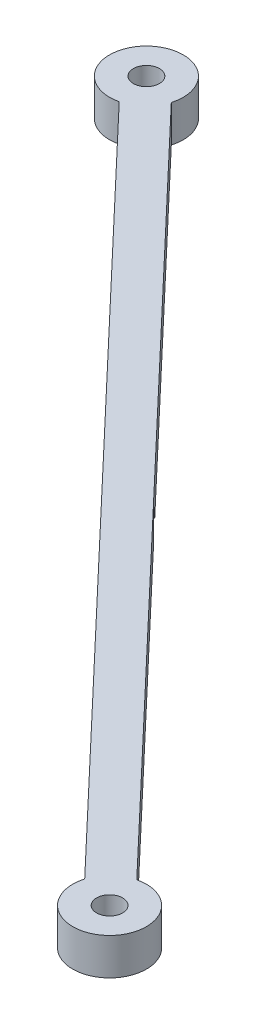
ISO-10303-21;
HEADER;
FILE_DESCRIPTION(('STEP AP214'),'2;1');
FILE_NAME('part.step','',(''),(''),'','','');
FILE_SCHEMA(('AUTOMOTIVE_DESIGN { 1 0 10303 214 1 1 1 1 }'));
ENDSEC;
DATA;
#1=APPLICATION_CONTEXT('core data for automotive mechanical design processes');
#2=APPLICATION_PROTOCOL_DEFINITION('international standard','automotive_design',2000,#1);
#3=PRODUCT_CONTEXT('',#1,'mechanical');
#4=PRODUCT('Part','Part','',(#3));
#5=PRODUCT_RELATED_PRODUCT_CATEGORY('part','',(#4));
#6=PRODUCT_DEFINITION_FORMATION('','',#4);
#7=PRODUCT_DEFINITION_CONTEXT('part definition',#1,'design');
#8=PRODUCT_DEFINITION('design','',#6,#7);
#9=PRODUCT_DEFINITION_SHAPE('','',#8);
#10=(LENGTH_UNIT() NAMED_UNIT(*) SI_UNIT(.MILLI.,.METRE.));
#11=(NAMED_UNIT(*) PLANE_ANGLE_UNIT() SI_UNIT($,.RADIAN.));
#12=(NAMED_UNIT(*) SI_UNIT($,.STERADIAN.) SOLID_ANGLE_UNIT());
#13=UNCERTAINTY_MEASURE_WITH_UNIT(LENGTH_MEASURE(1.E-05),#10,'distance_accuracy_value','');
#14=(GEOMETRIC_REPRESENTATION_CONTEXT(3) GLOBAL_UNCERTAINTY_ASSIGNED_CONTEXT((#13)) GLOBAL_UNIT_ASSIGNED_CONTEXT((#10,
#11,#12)) REPRESENTATION_CONTEXT('',''));
#15=CARTESIAN_POINT('',(0.,0.,0.));
#16=DIRECTION('',(0.,0.,1.));
#17=DIRECTION('',(1.,0.,0.));
#18=AXIS2_PLACEMENT_3D('',#15,#16,#17);
#19=CARTESIAN_POINT('',(0.,0.,0.));
#20=DIRECTION('',(0.,1.,0.));
#21=DIRECTION('',(0.,0.,1.));
#22=AXIS2_PLACEMENT_3D('',#19,#20,#21);
#23=PLANE('',#22);
#24=CARTESIAN_POINT('',(-28.3882084843557,0.,6.42766488000816));
#25=DIRECTION('',(0.,1.,0.));
#26=DIRECTION('',(0.,0.,1.));
#27=AXIS2_PLACEMENT_3D('',#24,#25,#26);
#28=CIRCLE('',#27,2.2479);
#29=CARTESIAN_POINT('',(-28.3882084843557,0.,8.67556488000816));
#30=VERTEX_POINT('',#29);
#31=EDGE_CURVE('E143',#30,#30,#28,.T.);
#32=ORIENTED_EDGE('',*,*,#31,.T.);
#33=EDGE_LOOP('',(#32));
#34=FACE_BOUND('',#33,.T.);
#35=DIRECTION('',(-0.688749461914693,0.,-0.724999433594414));
#36=VECTOR('',#35,1.);
#37=CARTESIAN_POINT('',(-15.8292648379506,0.,15.0378015960531));
#38=LINE('',#37,#36);
#39=CARTESIAN_POINT('',(31.9273773785152,0.,65.307951297596));
#40=VERTEX_POINT('',#39);
#41=CARTESIAN_POINT('',(-22.2987220117262,0.,8.22784667628931));
#42=VERTEX_POINT('',#41);
#43=EDGE_CURVE('E163',#40,#42,#38,.T.);
#44=ORIENTED_EDGE('',*,*,#43,.F.);
#45=DIRECTION('',(0.686088283890144,0.,-0.727518293040579));
#46=VECTOR('',#45,1.);
#47=CARTESIAN_POINT('',(31.9273773785152,0.,65.307951297596));
#48=LINE('',#47,#46);
#49=CARTESIAN_POINT('',(27.5641346062818,0.,69.9346720976923));
#50=VERTEX_POINT('',#49);
#51=EDGE_CURVE('E122',#50,#40,#48,.T.);
#52=ORIENTED_EDGE('',*,*,#51,.F.);
#53=DIRECTION('',(-0.688749461914693,0.,-0.724999433594414));
#54=VECTOR('',#53,1.);
#55=CARTESIAN_POINT('',(-20.4330112412751,0.,19.4113606792114));
#56=LINE('',#55,#54);
#57=CARTESIAN_POINT('',(-26.9024684150507,0.,12.6014057594476));
#58=VERTEX_POINT('',#57);
#59=EDGE_CURVE('E78',#50,#58,#56,.T.);
#60=ORIENTED_EDGE('',*,*,#59,.T.);
#61=CARTESIAN_POINT('',(-28.3882084843557,0.,6.42766488000816));
#62=DIRECTION('',(0.,1.,0.));
#63=DIRECTION('',(0.,0.,1.));
#64=AXIS2_PLACEMENT_3D('',#61,#62,#63);
#65=CIRCLE('',#64,6.35);
#66=EDGE_CURVE('E165',#42,#58,#65,.T.);
#67=ORIENTED_EDGE('',*,*,#66,.F.);
#68=EDGE_LOOP('',(#44,#52,#60,#67));
#69=FACE_BOUND('',#68,.T.);
#70=ADVANCED_FACE('F33',(#34,#69),#23,.F.);
#71=CARTESIAN_POINT('',(-20.4330112412751,6.35,19.4113606792114));
#72=DIRECTION('',(-0.724999433594414,0.,0.688749461914693));
#73=DIRECTION('',(0.688749461914693,0.,0.724999433594414));
#74=AXIS2_PLACEMENT_3D('',#71,#72,#73);
#75=PLANE('',#74);
#76=DIRECTION('',(0.,-1.,0.));
#77=VECTOR('',#76,1.);
#78=CARTESIAN_POINT('',(27.5641346062818,3.175,69.9346720976923));
#79=LINE('',#78,#77);
#80=CARTESIAN_POINT('',(27.5641346062818,3.175,69.9346720976923));
#81=VERTEX_POINT('',#80);
#82=EDGE_CURVE('E128',#81,#50,#79,.T.);
#83=ORIENTED_EDGE('',*,*,#82,.F.);
#84=DIRECTION('',(0.688749461914693,0.,0.724999433594414));
#85=VECTOR('',#84,1.);
#86=CARTESIAN_POINT('',(-20.4330112412751,3.175,19.4113606792114));
#87=LINE('',#86,#85);
#88=CARTESIAN_POINT('',(31.9434483698445,3.175,74.5444760593373));
#89=VERTEX_POINT('',#88);
#90=EDGE_CURVE('E136',#81,#89,#87,.T.);
#91=ORIENTED_EDGE('',*,*,#90,.T.);
#92=DIRECTION('',(0.,1.,0.));
#93=VECTOR('',#92,1.);
#94=CARTESIAN_POINT('',(31.9434483698445,6.35,74.5444760593373));
#95=LINE('',#94,#93);
#96=CARTESIAN_POINT('',(31.9434483698445,0.,74.5444760593373));
#97=VERTEX_POINT('',#96);
#98=EDGE_CURVE('E110',#97,#89,#95,.T.);
#99=ORIENTED_EDGE('',*,*,#98,.F.);
#100=CARTESIAN_POINT('',(86.1723050430148,0.,131.627483083727));
#101=VERTEX_POINT('',#100);
#102=EDGE_CURVE('E157',#101,#97,#56,.T.);
#103=ORIENTED_EDGE('',*,*,#102,.F.);
#104=DIRECTION('',(0.,-1.,0.));
#105=VECTOR('',#104,1.);
#106=CARTESIAN_POINT('',(86.1723050430148,6.35,131.627483083727));
#107=LINE('',#106,#105);
#108=CARTESIAN_POINT('',(86.1723050430148,6.35,131.627483083727));
#109=VERTEX_POINT('',#108);
#110=EDGE_CURVE('E11',#109,#101,#107,.T.);
#111=ORIENTED_EDGE('',*,*,#110,.F.);
#112=DIRECTION('',(-0.688749461914693,0.,-0.724999433594414));
#113=VECTOR('',#112,1.);
#114=CARTESIAN_POINT('',(-20.4330112412751,6.35,19.4113606792114));
#115=LINE('',#114,#113);
#116=CARTESIAN_POINT('',(-26.9024684150507,6.35,12.6014057594476));
#117=VERTEX_POINT('',#116);
#118=EDGE_CURVE('E142',#109,#117,#115,.T.);
#119=ORIENTED_EDGE('',*,*,#118,.T.);
#120=DIRECTION('',(0.,-1.,0.));
#121=VECTOR('',#120,1.);
#122=CARTESIAN_POINT('',(-26.9024684150507,6.35,12.6014057594476));
#123=LINE('',#122,#121);
#124=EDGE_CURVE('E154',#117,#58,#123,.T.);
#125=ORIENTED_EDGE('',*,*,#124,.T.);
#126=ORIENTED_EDGE('',*,*,#59,.F.);
#127=EDGE_LOOP('',(#83,#91,#99,#103,#111,#119,#125,#126));
#128=FACE_BOUND('',#127,.T.);
#129=ADVANCED_FACE('F181',(#128),#75,.T.);
#130=CARTESIAN_POINT('',(92.2617915156443,6.35,133.427664880008));
#131=DIRECTION('',(0.,-1.,0.));
#132=DIRECTION('',(0.,0.,-1.));
#133=AXIS2_PLACEMENT_3D('',#130,#131,#132);
#134=CYLINDRICAL_SURFACE('',#133,6.34999999999999);
#135=CARTESIAN_POINT('',(92.2617915156443,0.,133.427664880008));
#136=DIRECTION('',(0.,1.,0.));
#137=DIRECTION('',(0.,0.,1.));
#138=AXIS2_PLACEMENT_3D('',#135,#136,#137);
#139=CIRCLE('',#138,6.34999999999999);
#140=CARTESIAN_POINT('',(90.7760514463393,0.,127.253924000569));
#141=VERTEX_POINT('',#140);
#142=EDGE_CURVE('E160',#101,#141,#139,.T.);
#143=ORIENTED_EDGE('',*,*,#142,.T.);
#144=DIRECTION('',(0.,-1.,0.));
#145=VECTOR('',#144,1.);
#146=CARTESIAN_POINT('',(90.7760514463393,6.35,127.253924000569));
#147=LINE('',#146,#145);
#148=CARTESIAN_POINT('',(90.7760514463393,6.35,127.253924000569));
#149=VERTEX_POINT('',#148);
#150=EDGE_CURVE('E41',#149,#141,#147,.T.);
#151=ORIENTED_EDGE('',*,*,#150,.F.);
#152=CARTESIAN_POINT('',(92.2617915156443,6.35,133.427664880008));
#153=DIRECTION('',(0.,1.,0.));
#154=DIRECTION('',(0.,0.,1.));
#155=AXIS2_PLACEMENT_3D('',#152,#153,#154);
#156=CIRCLE('',#155,6.34999999999999);
#157=EDGE_CURVE('E145',#109,#149,#156,.T.);
#158=ORIENTED_EDGE('',*,*,#157,.F.);
#159=ORIENTED_EDGE('',*,*,#110,.T.);
#160=EDGE_LOOP('',(#143,#151,#158,#159));
#161=FACE_BOUND('',#160,.T.);
#162=ADVANCED_FACE('F177',(#161),#134,.T.);
#163=CARTESIAN_POINT('',(-15.8292648379506,6.35,15.0378015960531));
#164=DIRECTION('',(-0.724999433594414,0.,0.688749461914693));
#165=DIRECTION('',(0.688749461914693,0.,0.724999433594414));
#166=AXIS2_PLACEMENT_3D('',#163,#164,#165);
#167=PLANE('',#166);
#168=DIRECTION('',(0.688749461914693,0.,0.724999433594414));
#169=VECTOR('',#168,1.);
#170=CARTESIAN_POINT('',(36.3227621867349,3.175,69.9346721483537));
#171=LINE('',#170,#169);
#172=CARTESIAN_POINT('',(31.9273773785152,3.175,65.307951297596));
#173=VERTEX_POINT('',#172);
#174=CARTESIAN_POINT('',(36.3227621867349,3.175,69.9346721483537));
#175=VERTEX_POINT('',#174);
#176=EDGE_CURVE('E114',#173,#175,#171,.T.);
#177=ORIENTED_EDGE('',*,*,#176,.F.);
#178=DIRECTION('',(0.,-1.,0.));
#179=VECTOR('',#178,1.);
#180=CARTESIAN_POINT('',(31.9273773785152,3.175,65.307951297596));
#181=LINE('',#180,#179);
#182=EDGE_CURVE('E130',#173,#40,#181,.T.);
#183=ORIENTED_EDGE('',*,*,#182,.T.);
#184=ORIENTED_EDGE('',*,*,#43,.T.);
#185=DIRECTION('',(0.,-1.,0.));
#186=VECTOR('',#185,1.);
#187=CARTESIAN_POINT('',(-22.2987220117262,6.35,8.22784667628931));
#188=LINE('',#187,#186);
#189=CARTESIAN_POINT('',(-22.2987220117262,6.35,8.22784667628931));
#190=VERTEX_POINT('',#189);
#191=EDGE_CURVE('E171',#190,#42,#188,.T.);
#192=ORIENTED_EDGE('',*,*,#191,.F.);
#193=DIRECTION('',(-0.688749461914693,0.,-0.724999433594414));
#194=VECTOR('',#193,1.);
#195=CARTESIAN_POINT('',(-15.8292648379506,6.35,15.0378015960531));
#196=LINE('',#195,#194);
#197=EDGE_CURVE('E148',#149,#190,#196,.T.);
#198=ORIENTED_EDGE('',*,*,#197,.F.);
#199=ORIENTED_EDGE('',*,*,#150,.T.);
#200=CARTESIAN_POINT('',(36.3227621867349,0.,69.9346721483537));
#201=VERTEX_POINT('',#200);
#202=EDGE_CURVE('E127',#141,#201,#38,.T.);
#203=ORIENTED_EDGE('',*,*,#202,.T.);
#204=DIRECTION('',(0.,-1.,0.));
#205=VECTOR('',#204,1.);
#206=CARTESIAN_POINT('',(36.3227621867349,3.175,69.9346721483537));
#207=LINE('',#206,#205);
#208=EDGE_CURVE('E48',#175,#201,#207,.T.);
#209=ORIENTED_EDGE('',*,*,#208,.F.);
#210=EDGE_LOOP('',(#177,#183,#184,#192,#198,#199,#203,#209));
#211=FACE_BOUND('',#210,.T.);
#212=ADVANCED_FACE('F125',(#211),#167,.F.);
#213=CARTESIAN_POINT('',(-28.3882084843557,6.35,6.42766488000816));
#214=DIRECTION('',(0.,-1.,0.));
#215=DIRECTION('',(0.,0.,-1.));
#216=AXIS2_PLACEMENT_3D('',#213,#214,#215);
#217=CYLINDRICAL_SURFACE('',#216,6.35);
#218=ORIENTED_EDGE('',*,*,#66,.T.);
#219=ORIENTED_EDGE('',*,*,#124,.F.);
#220=CARTESIAN_POINT('',(-28.3882084843557,6.35,6.42766488000816));
#221=DIRECTION('',(0.,1.,0.));
#222=DIRECTION('',(0.,0.,1.));
#223=AXIS2_PLACEMENT_3D('',#220,#221,#222);
#224=CIRCLE('',#223,6.35);
#225=EDGE_CURVE('E57',#190,#117,#224,.T.);
#226=ORIENTED_EDGE('',*,*,#225,.F.);
#227=ORIENTED_EDGE('',*,*,#191,.T.);
#228=EDGE_LOOP('',(#218,#219,#226,#227));
#229=FACE_BOUND('',#228,.T.);
#230=ADVANCED_FACE('F189',(#229),#217,.T.);
#231=CARTESIAN_POINT('',(92.2617915156443,6.35,133.427664880008));
#232=DIRECTION('',(0.,-1.,0.));
#233=DIRECTION('',(0.,0.,-1.));
#234=AXIS2_PLACEMENT_3D('',#231,#232,#233);
#235=CYLINDRICAL_SURFACE('',#234,2.2479);
#236=CARTESIAN_POINT('',(92.2617915156443,6.35,133.427664880008));
#237=DIRECTION('',(0.,1.,0.));
#238=DIRECTION('',(0.,0.,1.));
#239=AXIS2_PLACEMENT_3D('',#236,#237,#238);
#240=CIRCLE('',#239,2.2479);
#241=CARTESIAN_POINT('',(92.2617915156443,6.35,135.675564880008));
#242=VERTEX_POINT('',#241);
#243=EDGE_CURVE('E139',#242,#242,#240,.T.);
#244=ORIENTED_EDGE('',*,*,#243,.T.);
#245=EDGE_LOOP('',(#244));
#246=FACE_BOUND('',#245,.T.);
#247=CARTESIAN_POINT('',(92.2617915156443,0.,133.427664880008));
#248=DIRECTION('',(0.,1.,0.));
#249=DIRECTION('',(0.,0.,1.));
#250=AXIS2_PLACEMENT_3D('',#247,#248,#249);
#251=CIRCLE('',#250,2.2479);
#252=CARTESIAN_POINT('',(92.2617915156443,0.,135.675564880008));
#253=VERTEX_POINT('',#252);
#254=EDGE_CURVE('E138',#253,#253,#251,.T.);
#255=ORIENTED_EDGE('',*,*,#254,.F.);
#256=EDGE_LOOP('',(#255));
#257=FACE_BOUND('',#256,.T.);
#258=ADVANCED_FACE('F35',(#246,#257),#235,.F.);
#259=CARTESIAN_POINT('',(-28.3882084843557,6.35,6.42766488000816));
#260=DIRECTION('',(0.,-1.,0.));
#261=DIRECTION('',(0.,0.,-1.));
#262=AXIS2_PLACEMENT_3D('',#259,#260,#261);
#263=CYLINDRICAL_SURFACE('',#262,2.2479);
#264=CARTESIAN_POINT('',(-28.3882084843557,6.35,6.42766488000816));
#265=DIRECTION('',(0.,1.,0.));
#266=DIRECTION('',(0.,0.,1.));
#267=AXIS2_PLACEMENT_3D('',#264,#265,#266);
#268=CIRCLE('',#267,2.2479);
#269=CARTESIAN_POINT('',(-28.3882084843557,6.35,8.67556488000816));
#270=VERTEX_POINT('',#269);
#271=EDGE_CURVE('E151',#270,#270,#268,.T.);
#272=ORIENTED_EDGE('',*,*,#271,.T.);
#273=EDGE_LOOP('',(#272));
#274=FACE_BOUND('',#273,.T.);
#275=ORIENTED_EDGE('',*,*,#31,.F.);
#276=EDGE_LOOP('',(#275));
#277=FACE_BOUND('',#276,.T.);
#278=ADVANCED_FACE('F193',(#274,#277),#263,.F.);
#279=CARTESIAN_POINT('',(0.,6.35,0.));
#280=DIRECTION('',(0.,1.,0.));
#281=DIRECTION('',(0.,0.,1.));
#282=AXIS2_PLACEMENT_3D('',#279,#280,#281);
#283=PLANE('',#282);
#284=ORIENTED_EDGE('',*,*,#243,.F.);
#285=EDGE_LOOP('',(#284));
#286=FACE_BOUND('',#285,.T.);
#287=ORIENTED_EDGE('',*,*,#118,.F.);
#288=ORIENTED_EDGE('',*,*,#157,.T.);
#289=ORIENTED_EDGE('',*,*,#197,.T.);
#290=ORIENTED_EDGE('',*,*,#225,.T.);
#291=EDGE_LOOP('',(#287,#288,#289,#290));
#292=FACE_BOUND('',#291,.T.);
#293=ORIENTED_EDGE('',*,*,#271,.F.);
#294=EDGE_LOOP('',(#293));
#295=FACE_BOUND('',#294,.T.);
#296=ADVANCED_FACE('F190',(#286,#292,#295),#283,.T.);
#297=ORIENTED_EDGE('',*,*,#254,.T.);
#298=EDGE_LOOP('',(#297));
#299=FACE_BOUND('',#298,.T.);
#300=ORIENTED_EDGE('',*,*,#102,.T.);
#301=DIRECTION('',(-0.688749470301724,0.,0.724999425626734));
#302=VECTOR('',#301,1.);
#303=CARTESIAN_POINT('',(31.8546286108421,0.,74.6379705403318));
#304=LINE('',#303,#302);
#305=EDGE_CURVE('E187',#201,#97,#304,.T.);
#306=ORIENTED_EDGE('',*,*,#305,.F.);
#307=ORIENTED_EDGE('',*,*,#202,.F.);
#308=ORIENTED_EDGE('',*,*,#142,.F.);
#309=EDGE_LOOP('',(#300,#306,#307,#308));
#310=FACE_BOUND('',#309,.T.);
#311=ADVANCED_FACE('F179',(#299,#310),#23,.F.);
#312=CARTESIAN_POINT('',(31.9273773785152,3.175,65.307951297596));
#313=DIRECTION('',(-0.727518293040579,0.,-0.686088283890144));
#314=DIRECTION('',(-0.686088283890144,0.,0.727518293040579));
#315=AXIS2_PLACEMENT_3D('',#312,#313,#314);
#316=PLANE('',#315);
#317=ORIENTED_EDGE('',*,*,#51,.T.);
#318=ORIENTED_EDGE('',*,*,#182,.F.);
#319=DIRECTION('',(0.686088283890144,0.,-0.727518293040579));
#320=VECTOR('',#319,1.);
#321=CARTESIAN_POINT('',(31.9273773785152,3.175,65.307951297596));
#322=LINE('',#321,#320);
#323=EDGE_CURVE('E113',#81,#173,#322,.T.);
#324=ORIENTED_EDGE('',*,*,#323,.F.);
#325=ORIENTED_EDGE('',*,*,#82,.T.);
#326=EDGE_LOOP('',(#317,#318,#324,#325));
#327=FACE_BOUND('',#326,.T.);
#328=ADVANCED_FACE('F183',(#327),#316,.F.);
#329=CARTESIAN_POINT('',(31.8546286108421,3.175,74.6379705403318));
#330=DIRECTION('',(0.724999425626734,0.,0.688749470301724));
#331=DIRECTION('',(0.688749470301724,0.,-0.724999425626734));
#332=AXIS2_PLACEMENT_3D('',#329,#330,#331);
#333=PLANE('',#332);
#334=ORIENTED_EDGE('',*,*,#98,.T.);
#335=DIRECTION('',(-0.688749470301724,0.,0.724999425626734));
#336=VECTOR('',#335,1.);
#337=CARTESIAN_POINT('',(31.8546286108421,3.175,74.6379705403318));
#338=LINE('',#337,#336);
#339=EDGE_CURVE('E106',#175,#89,#338,.T.);
#340=ORIENTED_EDGE('',*,*,#339,.F.);
#341=ORIENTED_EDGE('',*,*,#208,.T.);
#342=ORIENTED_EDGE('',*,*,#305,.T.);
#343=EDGE_LOOP('',(#334,#340,#341,#342));
#344=FACE_BOUND('',#343,.T.);
#345=ADVANCED_FACE('F108',(#344),#333,.F.);
#346=CARTESIAN_POINT('',(0.,3.175,0.));
#347=DIRECTION('',(0.,-1.,0.));
#348=DIRECTION('',(0.,0.,-1.));
#349=AXIS2_PLACEMENT_3D('',#346,#347,#348);
#350=PLANE('',#349);
#351=ORIENTED_EDGE('',*,*,#323,.T.);
#352=ORIENTED_EDGE('',*,*,#176,.T.);
#353=ORIENTED_EDGE('',*,*,#339,.T.);
#354=ORIENTED_EDGE('',*,*,#90,.F.);
#355=EDGE_LOOP('',(#351,#352,#353,#354));
#356=FACE_BOUND('',#355,.T.);
#357=ADVANCED_FACE('F118',(#356),#350,.T.);
#358=CLOSED_SHELL('',(#70,#129,#162,#212,#230,#258,#278,#296,#311,#328,#345,#357));
#359=MANIFOLD_SOLID_BREP('B2',#358);
#360=ADVANCED_BREP_SHAPE_REPRESENTATION('',(#18,#359),#14);
#361=SHAPE_DEFINITION_REPRESENTATION(#9,#360);
ENDSEC;
END-ISO-10303-21;
